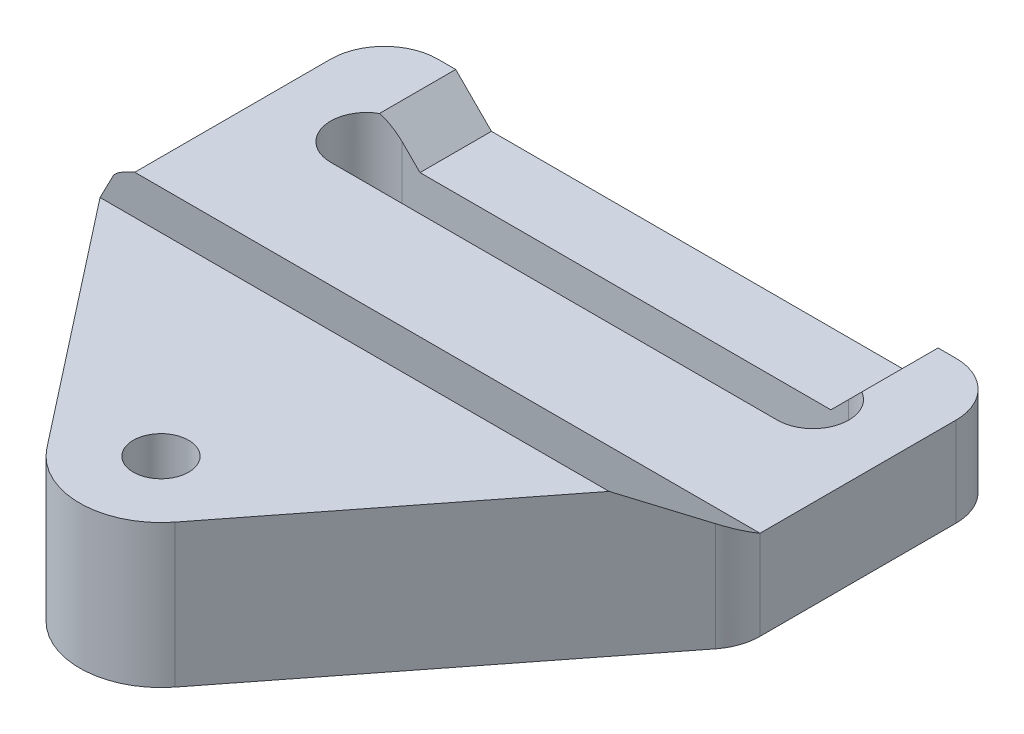
ISO-10303-21;
HEADER;
FILE_DESCRIPTION(('STEP AP214'),'2;1');
FILE_NAME('part.step','',(''),(''),'','','');
FILE_SCHEMA(('AUTOMOTIVE_DESIGN { 1 0 10303 214 1 1 1 1 }'));
ENDSEC;
DATA;
#1=APPLICATION_CONTEXT('core data for automotive mechanical design processes');
#2=APPLICATION_PROTOCOL_DEFINITION('international standard','automotive_design',2000,#1);
#3=PRODUCT_CONTEXT('',#1,'mechanical');
#4=PRODUCT('Part','Part','',(#3));
#5=PRODUCT_RELATED_PRODUCT_CATEGORY('part','',(#4));
#6=PRODUCT_DEFINITION_FORMATION('','',#4);
#7=PRODUCT_DEFINITION_CONTEXT('part definition',#1,'design');
#8=PRODUCT_DEFINITION('design','',#6,#7);
#9=PRODUCT_DEFINITION_SHAPE('','',#8);
#10=(LENGTH_UNIT() NAMED_UNIT(*) SI_UNIT(.MILLI.,.METRE.));
#11=(NAMED_UNIT(*) PLANE_ANGLE_UNIT() SI_UNIT($,.RADIAN.));
#12=(NAMED_UNIT(*) SI_UNIT($,.STERADIAN.) SOLID_ANGLE_UNIT());
#13=UNCERTAINTY_MEASURE_WITH_UNIT(LENGTH_MEASURE(1.E-05),#10,'distance_accuracy_value','');
#14=(GEOMETRIC_REPRESENTATION_CONTEXT(3) GLOBAL_UNCERTAINTY_ASSIGNED_CONTEXT((#13)) GLOBAL_UNIT_ASSIGNED_CONTEXT((#10,
#11,#12)) REPRESENTATION_CONTEXT('',''));
#15=CARTESIAN_POINT('',(0.,0.,0.));
#16=DIRECTION('',(0.,0.,1.));
#17=DIRECTION('',(1.,0.,0.));
#18=AXIS2_PLACEMENT_3D('',#15,#16,#17);
#19=CARTESIAN_POINT('',(12.5,5.,-24.));
#20=DIRECTION('',(0.,-1.,0.));
#21=DIRECTION('',(0.,0.,-1.));
#22=AXIS2_PLACEMENT_3D('',#19,#20,#21);
#23=CYLINDRICAL_SURFACE('',#22,1.99999999999999);
#24=CARTESIAN_POINT('',(12.5,5.,-24.));
#25=DIRECTION('',(0.,1.,0.));
#26=DIRECTION('',(0.,0.,1.));
#27=AXIS2_PLACEMENT_3D('',#24,#25,#26);
#28=CIRCLE('',#27,1.99999999999999);
#29=CARTESIAN_POINT('',(12.5,5.,-22.));
#30=VERTEX_POINT('',#29);
#31=CARTESIAN_POINT('',(13.5,5.,-25.7320508075689));
#32=VERTEX_POINT('',#31);
#33=EDGE_CURVE('E222',#30,#32,#28,.T.);
#34=ORIENTED_EDGE('',*,*,#33,.T.);
#35=CARTESIAN_POINT('',(12.5,4.00000000000006,-24.));
#36=DIRECTION('',(-0.707106781186544,0.707106781186551,0.));
#37=DIRECTION('',(-0.707106781186551,-0.707106781186544,0.));
#38=AXIS2_PLACEMENT_3D('',#35,#36,#37);
#39=ELLIPSE('',#38,2.82842712474616,1.99999999999999);
#40=CARTESIAN_POINT('',(12.5,4.00000000000006,-26.));
#41=VERTEX_POINT('',#40);
#42=EDGE_CURVE('E333',#32,#41,#39,.T.);
#43=ORIENTED_EDGE('',*,*,#42,.T.);
#44=DIRECTION('',(0.,-1.,0.));
#45=VECTOR('',#44,1.);
#46=CARTESIAN_POINT('',(12.5,5.,-26.));
#47=LINE('',#46,#45);
#48=CARTESIAN_POINT('',(12.5,0.,-26.));
#49=VERTEX_POINT('',#48);
#50=EDGE_CURVE('E256',#41,#49,#47,.T.);
#51=ORIENTED_EDGE('',*,*,#50,.T.);
#52=CARTESIAN_POINT('',(12.5,0.,-24.));
#53=DIRECTION('',(0.,1.,0.));
#54=DIRECTION('',(0.,0.,1.));
#55=AXIS2_PLACEMENT_3D('',#52,#53,#54);
#56=CIRCLE('',#55,1.99999999999999);
#57=CARTESIAN_POINT('',(12.5,0.,-22.));
#58=VERTEX_POINT('',#57);
#59=EDGE_CURVE('E221',#58,#49,#56,.T.);
#60=ORIENTED_EDGE('',*,*,#59,.F.);
#61=DIRECTION('',(0.,-1.,0.));
#62=VECTOR('',#61,1.);
#63=CARTESIAN_POINT('',(12.5,5.,-22.));
#64=LINE('',#63,#62);
#65=EDGE_CURVE('E232',#30,#58,#64,.T.);
#66=ORIENTED_EDGE('',*,*,#65,.F.);
#67=EDGE_LOOP('',(#34,#43,#51,#60,#66));
#68=FACE_BOUND('',#67,.T.);
#69=ADVANCED_FACE('F41',(#68),#23,.F.);
#70=CARTESIAN_POINT('',(0.,5.,0.));
#71=DIRECTION('',(0.,1.,0.));
#72=DIRECTION('',(0.,0.,1.));
#73=AXIS2_PLACEMENT_3D('',#70,#71,#72);
#74=PLANE('',#73);
#75=DIRECTION('',(-1.,0.,0.));
#76=VECTOR('',#75,1.);
#77=CARTESIAN_POINT('',(-17.5,5.,-16.0333739025132));
#78=LINE('',#77,#76);
#79=CARTESIAN_POINT('',(17.5,5.,-16.0333739025132));
#80=VERTEX_POINT('',#79);
#81=CARTESIAN_POINT('',(-17.5,5.,-16.0333739025132));
#82=VERTEX_POINT('',#81);
#83=EDGE_CURVE('E203',#80,#82,#78,.T.);
#84=ORIENTED_EDGE('',*,*,#83,.F.);
#85=DIRECTION('',(0.,0.,-1.));
#86=VECTOR('',#85,1.);
#87=CARTESIAN_POINT('',(17.5,5.,-27.));
#88=LINE('',#87,#86);
#89=CARTESIAN_POINT('',(17.5,5.,-27.));
#90=VERTEX_POINT('',#89);
#91=EDGE_CURVE('E263',#80,#90,#88,.T.);
#92=ORIENTED_EDGE('',*,*,#91,.T.);
#93=CARTESIAN_POINT('',(14.5,5.,-27.));
#94=DIRECTION('',(0.,1.,0.));
#95=DIRECTION('',(0.,0.,-1.));
#96=AXIS2_PLACEMENT_3D('',#93,#94,#95);
#97=CIRCLE('',#96,3.);
#98=CARTESIAN_POINT('',(14.5,5.,-30.));
#99=VERTEX_POINT('',#98);
#100=EDGE_CURVE('E266',#90,#99,#97,.T.);
#101=ORIENTED_EDGE('',*,*,#100,.T.);
#102=DIRECTION('',(-1.,0.,0.));
#103=VECTOR('',#102,1.);
#104=CARTESIAN_POINT('',(-14.5,5.,-30.));
#105=LINE('',#104,#103);
#106=CARTESIAN_POINT('',(13.5,5.,-30.));
#107=VERTEX_POINT('',#106);
#108=EDGE_CURVE('E354',#99,#107,#105,.T.);
#109=ORIENTED_EDGE('',*,*,#108,.T.);
#110=DIRECTION('',(0.,0.,-1.));
#111=VECTOR('',#110,1.);
#112=CARTESIAN_POINT('',(13.4999999999999,5.,0.));
#113=LINE('',#112,#111);
#114=EDGE_CURVE('E329',#107,#32,#113,.F.);
#115=ORIENTED_EDGE('',*,*,#114,.T.);
#116=ORIENTED_EDGE('',*,*,#33,.F.);
#117=DIRECTION('',(1.,0.,0.));
#118=VECTOR('',#117,1.);
#119=CARTESIAN_POINT('',(12.5,5.,-22.));
#120=LINE('',#119,#118);
#121=CARTESIAN_POINT('',(-12.5,5.,-22.));
#122=VERTEX_POINT('',#121);
#123=EDGE_CURVE('E229',#122,#30,#120,.T.);
#124=ORIENTED_EDGE('',*,*,#123,.F.);
#125=CARTESIAN_POINT('',(-12.5,5.,-24.));
#126=DIRECTION('',(0.,1.,0.));
#127=DIRECTION('',(0.,0.,1.));
#128=AXIS2_PLACEMENT_3D('',#125,#126,#127);
#129=CIRCLE('',#128,1.99999999999999);
#130=CARTESIAN_POINT('',(-13.5,5.,-25.7320508075689));
#131=VERTEX_POINT('',#130);
#132=EDGE_CURVE('E225',#131,#122,#129,.T.);
#133=ORIENTED_EDGE('',*,*,#132,.F.);
#134=DIRECTION('',(0.,0.,1.));
#135=VECTOR('',#134,1.);
#136=CARTESIAN_POINT('',(-13.4999999999999,5.,0.));
#137=LINE('',#136,#135);
#138=CARTESIAN_POINT('',(-13.5,5.,-30.));
#139=VERTEX_POINT('',#138);
#140=EDGE_CURVE('E348',#131,#139,#137,.F.);
#141=ORIENTED_EDGE('',*,*,#140,.T.);
#142=DIRECTION('',(1.,0.,0.));
#143=VECTOR('',#142,1.);
#144=CARTESIAN_POINT('',(0.,5.,-30.));
#145=LINE('',#144,#143);
#146=CARTESIAN_POINT('',(-14.5,5.,-30.));
#147=VERTEX_POINT('',#146);
#148=EDGE_CURVE('E358',#147,#139,#145,.T.);
#149=ORIENTED_EDGE('',*,*,#148,.F.);
#150=CARTESIAN_POINT('',(-14.5,5.,-27.));
#151=DIRECTION('',(0.,1.,0.));
#152=DIRECTION('',(0.,0.,-1.));
#153=AXIS2_PLACEMENT_3D('',#150,#151,#152);
#154=CIRCLE('',#153,3.);
#155=CARTESIAN_POINT('',(-17.5,5.,-27.));
#156=VERTEX_POINT('',#155);
#157=EDGE_CURVE('E271',#147,#156,#154,.T.);
#158=ORIENTED_EDGE('',*,*,#157,.T.);
#159=DIRECTION('',(0.,0.,1.));
#160=VECTOR('',#159,1.);
#161=CARTESIAN_POINT('',(-17.5,5.,-15.));
#162=LINE('',#161,#160);
#163=EDGE_CURVE('E274',#156,#82,#162,.T.);
#164=ORIENTED_EDGE('',*,*,#163,.T.);
#165=EDGE_LOOP('',(#84,#92,#101,#109,#115,#116,#124,#133,#141,#149,#158,#164));
#166=FACE_BOUND('',#165,.T.);
#167=ADVANCED_FACE('F398',(#166),#74,.T.);
#168=CARTESIAN_POINT('',(0.,0.,0.));
#169=DIRECTION('',(0.,1.,0.));
#170=DIRECTION('',(0.,0.,1.));
#171=AXIS2_PLACEMENT_3D('',#168,#169,#170);
#172=PLANE('',#171);
#173=CARTESIAN_POINT('',(0.,0.,0.));
#174=DIRECTION('',(0.,1.,0.));
#175=DIRECTION('',(0.,0.,1.));
#176=AXIS2_PLACEMENT_3D('',#173,#174,#175);
#177=CIRCLE('',#176,1.55);
#178=CARTESIAN_POINT('',(0.,0.,1.55));
#179=VERTEX_POINT('',#178);
#180=EDGE_CURVE('E259',#179,#179,#177,.T.);
#181=ORIENTED_EDGE('',*,*,#180,.T.);
#182=EDGE_LOOP('',(#181));
#183=FACE_BOUND('',#182,.T.);
#184=DIRECTION('',(0.,0.,-1.));
#185=VECTOR('',#184,1.);
#186=CARTESIAN_POINT('',(17.5,0.,-27.));
#187=LINE('',#186,#185);
#188=CARTESIAN_POINT('',(17.5,0.,-16.0333739025132));
#189=VERTEX_POINT('',#188);
#190=CARTESIAN_POINT('',(17.5,0.,-27.));
#191=VERTEX_POINT('',#190);
#192=EDGE_CURVE('E284',#189,#191,#187,.T.);
#193=ORIENTED_EDGE('',*,*,#192,.F.);
#194=CARTESIAN_POINT('',(14.5,0.,-16.0333739025132));
#195=DIRECTION('',(0.,1.,0.));
#196=DIRECTION('',(0.,0.,1.));
#197=AXIS2_PLACEMENT_3D('',#194,#195,#196);
#198=CIRCLE('',#197,3.);
#199=CARTESIAN_POINT('',(16.8636017284823,0.,-14.1858385526171));
#200=VERTEX_POINT('',#199);
#201=EDGE_CURVE('E369',#189,#200,#198,.F.);
#202=ORIENTED_EDGE('',*,*,#201,.T.);
#203=DIRECTION('',(0.615845116632009,0.,-0.787867242827436));
#204=VECTOR('',#203,1.);
#205=CARTESIAN_POINT('',(17.5,0.,-15.));
#206=LINE('',#205,#204);
#207=CARTESIAN_POINT('',(3.58479595486484,0.,2.80209528067564));
#208=VERTEX_POINT('',#207);
#209=EDGE_CURVE('E281',#208,#200,#206,.T.);
#210=ORIENTED_EDGE('',*,*,#209,.F.);
#211=CARTESIAN_POINT('',(0.,0.,0.));
#212=DIRECTION('',(0.,1.,0.));
#213=DIRECTION('',(0.,0.,1.));
#214=AXIS2_PLACEMENT_3D('',#211,#212,#213);
#215=CIRCLE('',#214,4.55);
#216=CARTESIAN_POINT('',(-3.58479595486484,0.,2.80209528067564));
#217=VERTEX_POINT('',#216);
#218=EDGE_CURVE('E182',#217,#208,#215,.T.);
#219=ORIENTED_EDGE('',*,*,#218,.F.);
#220=DIRECTION('',(0.615845116632009,0.,0.787867242827436));
#221=VECTOR('',#220,1.);
#222=CARTESIAN_POINT('',(-3.58479595486484,0.,2.80209528067564));
#223=LINE('',#222,#221);
#224=CARTESIAN_POINT('',(-16.8636017284823,0.,-14.1858385526171));
#225=VERTEX_POINT('',#224);
#226=EDGE_CURVE('E267',#225,#217,#223,.T.);
#227=ORIENTED_EDGE('',*,*,#226,.F.);
#228=CARTESIAN_POINT('',(-14.5,0.,-16.0333739025132));
#229=DIRECTION('',(0.,1.,0.));
#230=DIRECTION('',(0.,0.,1.));
#231=AXIS2_PLACEMENT_3D('',#228,#229,#230);
#232=CIRCLE('',#231,3.);
#233=CARTESIAN_POINT('',(-17.5,0.,-16.0333739025132));
#234=VERTEX_POINT('',#233);
#235=EDGE_CURVE('E366',#225,#234,#232,.F.);
#236=ORIENTED_EDGE('',*,*,#235,.T.);
#237=DIRECTION('',(0.,0.,1.));
#238=VECTOR('',#237,1.);
#239=CARTESIAN_POINT('',(-17.5,0.,-15.));
#240=LINE('',#239,#238);
#241=CARTESIAN_POINT('',(-17.5,0.,-27.));
#242=VERTEX_POINT('',#241);
#243=EDGE_CURVE('E298',#242,#234,#240,.T.);
#244=ORIENTED_EDGE('',*,*,#243,.F.);
#245=CARTESIAN_POINT('',(-14.5,0.,-27.));
#246=DIRECTION('',(0.,1.,0.));
#247=DIRECTION('',(0.,0.,-1.));
#248=AXIS2_PLACEMENT_3D('',#245,#246,#247);
#249=CIRCLE('',#248,3.);
#250=CARTESIAN_POINT('',(-14.5,0.,-30.));
#251=VERTEX_POINT('',#250);
#252=EDGE_CURVE('E295',#251,#242,#249,.T.);
#253=ORIENTED_EDGE('',*,*,#252,.F.);
#254=DIRECTION('',(-1.,0.,0.));
#255=VECTOR('',#254,1.);
#256=CARTESIAN_POINT('',(-14.5,0.,-30.));
#257=LINE('',#256,#255);
#258=CARTESIAN_POINT('',(14.5,0.,-30.));
#259=VERTEX_POINT('',#258);
#260=EDGE_CURVE('E291',#259,#251,#257,.T.);
#261=ORIENTED_EDGE('',*,*,#260,.F.);
#262=CARTESIAN_POINT('',(14.5,0.,-27.));
#263=DIRECTION('',(0.,1.,0.));
#264=DIRECTION('',(0.,0.,-1.));
#265=AXIS2_PLACEMENT_3D('',#262,#263,#264);
#266=CIRCLE('',#265,3.);
#267=EDGE_CURVE('E287',#191,#259,#266,.T.);
#268=ORIENTED_EDGE('',*,*,#267,.F.);
#269=EDGE_LOOP('',(#193,#202,#210,#219,#227,#236,#244,#253,#261,#268));
#270=FACE_BOUND('',#269,.T.);
#271=ORIENTED_EDGE('',*,*,#59,.T.);
#272=DIRECTION('',(-1.,0.,0.));
#273=VECTOR('',#272,1.);
#274=CARTESIAN_POINT('',(12.5,0.,-26.));
#275=LINE('',#274,#273);
#276=CARTESIAN_POINT('',(-12.5,0.,-26.));
#277=VERTEX_POINT('',#276);
#278=EDGE_CURVE('E236',#49,#277,#275,.T.);
#279=ORIENTED_EDGE('',*,*,#278,.T.);
#280=CARTESIAN_POINT('',(-12.5,0.,-24.));
#281=DIRECTION('',(0.,1.,0.));
#282=DIRECTION('',(0.,0.,1.));
#283=AXIS2_PLACEMENT_3D('',#280,#281,#282);
#284=CIRCLE('',#283,1.99999999999999);
#285=CARTESIAN_POINT('',(-12.5,0.,-22.));
#286=VERTEX_POINT('',#285);
#287=EDGE_CURVE('E240',#277,#286,#284,.T.);
#288=ORIENTED_EDGE('',*,*,#287,.T.);
#289=DIRECTION('',(1.,0.,0.));
#290=VECTOR('',#289,1.);
#291=CARTESIAN_POINT('',(12.5,0.,-22.));
#292=LINE('',#291,#290);
#293=EDGE_CURVE('E226',#286,#58,#292,.T.);
#294=ORIENTED_EDGE('',*,*,#293,.T.);
#295=EDGE_LOOP('',(#271,#279,#288,#294));
#296=FACE_BOUND('',#295,.T.);
#297=ADVANCED_FACE('F410',(#183,#270,#296),#172,.F.);
#298=CARTESIAN_POINT('',(0.,5.,0.));
#299=DIRECTION('',(0.,-1.,0.));
#300=DIRECTION('',(0.,0.,-1.));
#301=AXIS2_PLACEMENT_3D('',#298,#299,#300);
#302=CYLINDRICAL_SURFACE('',#301,4.55);
#303=ORIENTED_EDGE('',*,*,#218,.T.);
#304=DIRECTION('',(0.,-1.,0.));
#305=VECTOR('',#304,1.);
#306=CARTESIAN_POINT('',(3.58479595486484,5.,2.80209528067564));
#307=LINE('',#306,#305);
#308=CARTESIAN_POINT('',(3.58479595486484,8.,2.80209528067564));
#309=VERTEX_POINT('',#308);
#310=EDGE_CURVE('E175',#309,#208,#307,.T.);
#311=ORIENTED_EDGE('',*,*,#310,.F.);
#312=CARTESIAN_POINT('',(0.,8.,0.));
#313=DIRECTION('',(0.,1.,0.));
#314=DIRECTION('',(0.,0.,1.));
#315=AXIS2_PLACEMENT_3D('',#312,#313,#314);
#316=CIRCLE('',#315,4.55);
#317=CARTESIAN_POINT('',(-3.58479595486484,8.,2.80209528067564));
#318=VERTEX_POINT('',#317);
#319=EDGE_CURVE('E180',#318,#309,#316,.T.);
#320=ORIENTED_EDGE('',*,*,#319,.F.);
#321=DIRECTION('',(0.,-1.,0.));
#322=VECTOR('',#321,1.);
#323=CARTESIAN_POINT('',(-3.58479595486484,5.,2.80209528067564));
#324=LINE('',#323,#322);
#325=EDGE_CURVE('E278',#318,#217,#324,.T.);
#326=ORIENTED_EDGE('',*,*,#325,.T.);
#327=EDGE_LOOP('',(#303,#311,#320,#326));
#328=FACE_BOUND('',#327,.T.);
#329=ADVANCED_FACE('F177',(#328),#302,.T.);
#330=CARTESIAN_POINT('',(17.5,5.,-15.));
#331=DIRECTION('',(-0.787867242827437,0.,-0.615845116632009));
#332=DIRECTION('',(-0.615845116632009,0.,0.787867242827437));
#333=AXIS2_PLACEMENT_3D('',#330,#331,#332);
#334=PLANE('',#333);
#335=DIRECTION('',(0.,-1.,0.));
#336=VECTOR('',#335,1.);
#337=CARTESIAN_POINT('',(16.8636017284823,5.,-14.1858385526171));
#338=LINE('',#337,#336);
#339=CARTESIAN_POINT('',(16.8636017284823,6.06667503159982,-14.1858385526171));
#340=VERTEX_POINT('',#339);
#341=EDGE_CURVE('E372',#200,#340,#338,.F.);
#342=ORIENTED_EDGE('',*,*,#341,.T.);
#343=DIRECTION('',(-0.56057505957921,0.414051809130744,0.717158770380258));
#344=VECTOR('',#343,1.);
#345=CARTESIAN_POINT('',(9.76935542196278,11.3066254493698,-5.1099781998978));
#346=LINE('',#345,#344);
#347=CARTESIAN_POINT('',(14.2461182748484,8.,-10.8372214798065));
#348=VERTEX_POINT('',#347);
#349=EDGE_CURVE('E11',#340,#348,#346,.T.);
#350=ORIENTED_EDGE('',*,*,#349,.T.);
#351=DIRECTION('',(0.615845116632009,0.,-0.787867242827436));
#352=VECTOR('',#351,1.);
#353=CARTESIAN_POINT('',(3.58479595486484,8.,2.80209528067564));
#354=LINE('',#353,#352);
#355=EDGE_CURVE('E190',#309,#348,#354,.T.);
#356=ORIENTED_EDGE('',*,*,#355,.F.);
#357=ORIENTED_EDGE('',*,*,#310,.T.);
#358=ORIENTED_EDGE('',*,*,#209,.T.);
#359=EDGE_LOOP('',(#342,#350,#356,#357,#358));
#360=FACE_BOUND('',#359,.T.);
#361=ADVANCED_FACE('F191',(#360),#334,.F.);
#362=CARTESIAN_POINT('',(17.5,5.,-27.));
#363=DIRECTION('',(-1.,0.,0.));
#364=DIRECTION('',(0.,0.,1.));
#365=AXIS2_PLACEMENT_3D('',#362,#363,#364);
#366=PLANE('',#365);
#367=ORIENTED_EDGE('',*,*,#91,.F.);
#368=DIRECTION('',(0.,-1.,0.));
#369=VECTOR('',#368,1.);
#370=CARTESIAN_POINT('',(17.5,5.,-16.0333739025132));
#371=LINE('',#370,#369);
#372=EDGE_CURVE('E362',#80,#189,#371,.T.);
#373=ORIENTED_EDGE('',*,*,#372,.T.);
#374=ORIENTED_EDGE('',*,*,#192,.T.);
#375=DIRECTION('',(0.,-1.,0.));
#376=VECTOR('',#375,1.);
#377=CARTESIAN_POINT('',(17.5,5.,-27.));
#378=LINE('',#377,#376);
#379=EDGE_CURVE('E187',#90,#191,#378,.T.);
#380=ORIENTED_EDGE('',*,*,#379,.F.);
#381=EDGE_LOOP('',(#367,#373,#374,#380));
#382=FACE_BOUND('',#381,.T.);
#383=ADVANCED_FACE('F414',(#382),#366,.F.);
#384=CARTESIAN_POINT('',(14.5,5.,-27.));
#385=DIRECTION('',(0.,-1.,0.));
#386=DIRECTION('',(0.,0.,-1.));
#387=AXIS2_PLACEMENT_3D('',#384,#385,#386);
#388=CYLINDRICAL_SURFACE('',#387,3.);
#389=ORIENTED_EDGE('',*,*,#267,.T.);
#390=DIRECTION('',(0.,-1.,0.));
#391=VECTOR('',#390,1.);
#392=CARTESIAN_POINT('',(14.5,5.,-30.));
#393=LINE('',#392,#391);
#394=EDGE_CURVE('E313',#99,#259,#393,.T.);
#395=ORIENTED_EDGE('',*,*,#394,.F.);
#396=ORIENTED_EDGE('',*,*,#100,.F.);
#397=ORIENTED_EDGE('',*,*,#379,.T.);
#398=EDGE_LOOP('',(#389,#395,#396,#397));
#399=FACE_BOUND('',#398,.T.);
#400=ADVANCED_FACE('F420',(#399),#388,.T.);
#401=CARTESIAN_POINT('',(-14.5,5.,-30.));
#402=DIRECTION('',(0.,0.,1.));
#403=DIRECTION('',(1.,0.,0.));
#404=AXIS2_PLACEMENT_3D('',#401,#402,#403);
#405=PLANE('',#404);
#406=DIRECTION('',(0.,-1.,0.));
#407=VECTOR('',#406,1.);
#408=CARTESIAN_POINT('',(-14.5,5.,-30.));
#409=LINE('',#408,#407);
#410=EDGE_CURVE('E310',#147,#251,#409,.T.);
#411=ORIENTED_EDGE('',*,*,#410,.F.);
#412=ORIENTED_EDGE('',*,*,#148,.T.);
#413=DIRECTION('',(-0.707106781186551,0.707106781186544,0.));
#414=VECTOR('',#413,1.);
#415=CARTESIAN_POINT('',(-14.,5.5,-30.));
#416=LINE('',#415,#414);
#417=CARTESIAN_POINT('',(-11.5,3.,-30.));
#418=VERTEX_POINT('',#417);
#419=EDGE_CURVE('E351',#139,#418,#416,.F.);
#420=ORIENTED_EDGE('',*,*,#419,.T.);
#421=DIRECTION('',(-1.,0.,0.));
#422=VECTOR('',#421,1.);
#423=CARTESIAN_POINT('',(-14.5,3.,-30.));
#424=LINE('',#423,#422);
#425=CARTESIAN_POINT('',(11.4999999999999,3.,-30.));
#426=VERTEX_POINT('',#425);
#427=EDGE_CURVE('E212',#426,#418,#424,.T.);
#428=ORIENTED_EDGE('',*,*,#427,.F.);
#429=DIRECTION('',(-0.707106781186551,-0.707106781186544,0.));
#430=VECTOR('',#429,1.);
#431=CARTESIAN_POINT('',(-0.500000000000157,-8.99999999999997,-30.));
#432=LINE('',#431,#430);
#433=EDGE_CURVE('E326',#426,#107,#432,.F.);
#434=ORIENTED_EDGE('',*,*,#433,.T.);
#435=ORIENTED_EDGE('',*,*,#108,.F.);
#436=ORIENTED_EDGE('',*,*,#394,.T.);
#437=ORIENTED_EDGE('',*,*,#260,.T.);
#438=EDGE_LOOP('',(#411,#412,#420,#428,#434,#435,#436,#437));
#439=FACE_BOUND('',#438,.T.);
#440=ADVANCED_FACE('F448',(#439),#405,.F.);
#441=CARTESIAN_POINT('',(-14.5,5.,-27.));
#442=DIRECTION('',(0.,-1.,0.));
#443=DIRECTION('',(0.,0.,-1.));
#444=AXIS2_PLACEMENT_3D('',#441,#442,#443);
#445=CYLINDRICAL_SURFACE('',#444,3.);
#446=ORIENTED_EDGE('',*,*,#252,.T.);
#447=DIRECTION('',(0.,-1.,0.));
#448=VECTOR('',#447,1.);
#449=CARTESIAN_POINT('',(-17.5,5.,-27.));
#450=LINE('',#449,#448);
#451=EDGE_CURVE('E306',#156,#242,#450,.T.);
#452=ORIENTED_EDGE('',*,*,#451,.F.);
#453=ORIENTED_EDGE('',*,*,#157,.F.);
#454=ORIENTED_EDGE('',*,*,#410,.T.);
#455=EDGE_LOOP('',(#446,#452,#453,#454));
#456=FACE_BOUND('',#455,.T.);
#457=ADVANCED_FACE('F451',(#456),#445,.T.);
#458=CARTESIAN_POINT('',(-17.5,5.,-15.));
#459=DIRECTION('',(1.,0.,0.));
#460=DIRECTION('',(0.,0.,-1.));
#461=AXIS2_PLACEMENT_3D('',#458,#459,#460);
#462=PLANE('',#461);
#463=ORIENTED_EDGE('',*,*,#243,.T.);
#464=DIRECTION('',(0.,-1.,0.));
#465=VECTOR('',#464,1.);
#466=CARTESIAN_POINT('',(-17.5,5.,-16.0333739025132));
#467=LINE('',#466,#465);
#468=EDGE_CURVE('E378',#234,#82,#467,.F.);
#469=ORIENTED_EDGE('',*,*,#468,.T.);
#470=ORIENTED_EDGE('',*,*,#163,.F.);
#471=ORIENTED_EDGE('',*,*,#451,.T.);
#472=EDGE_LOOP('',(#463,#469,#470,#471));
#473=FACE_BOUND('',#472,.T.);
#474=ADVANCED_FACE('F404',(#473),#462,.F.);
#475=CARTESIAN_POINT('',(-3.58479595486484,5.,2.80209528067564));
#476=DIRECTION('',(0.787867242827437,0.,-0.615845116632009));
#477=DIRECTION('',(-0.615845116632009,0.,-0.787867242827437));
#478=AXIS2_PLACEMENT_3D('',#475,#476,#477);
#479=PLANE('',#478);
#480=DIRECTION('',(0.615845116632009,0.,0.787867242827437));
#481=VECTOR('',#480,1.);
#482=CARTESIAN_POINT('',(-16.8636017284823,8.,-14.1858385526171));
#483=LINE('',#482,#481);
#484=CARTESIAN_POINT('',(-14.2461182748484,8.,-10.8372214798065));
#485=VERTEX_POINT('',#484);
#486=EDGE_CURVE('E197',#485,#318,#483,.T.);
#487=ORIENTED_EDGE('',*,*,#486,.F.);
#488=DIRECTION('',(-0.56057505957921,-0.414051809130744,-0.717158770380258));
#489=VECTOR('',#488,1.);
#490=CARTESIAN_POINT('',(-9.76935542196279,11.3066254493698,-5.1099781998978));
#491=LINE('',#490,#489);
#492=CARTESIAN_POINT('',(-16.8636017284823,6.06667503159982,-14.1858385526171));
#493=VERTEX_POINT('',#492);
#494=EDGE_CURVE('E65',#485,#493,#491,.T.);
#495=ORIENTED_EDGE('',*,*,#494,.T.);
#496=DIRECTION('',(0.,-1.,0.));
#497=VECTOR('',#496,1.);
#498=CARTESIAN_POINT('',(-16.8636017284823,5.,-14.1858385526171));
#499=LINE('',#498,#497);
#500=EDGE_CURVE('E375',#493,#225,#499,.T.);
#501=ORIENTED_EDGE('',*,*,#500,.T.);
#502=ORIENTED_EDGE('',*,*,#226,.T.);
#503=ORIENTED_EDGE('',*,*,#325,.F.);
#504=EDGE_LOOP('',(#487,#495,#501,#502,#503));
#505=FACE_BOUND('',#504,.T.);
#506=ADVANCED_FACE('F406',(#505),#479,.F.);
#507=CARTESIAN_POINT('',(0.,5.,0.));
#508=DIRECTION('',(0.,-1.,0.));
#509=DIRECTION('',(0.,0.,-1.));
#510=AXIS2_PLACEMENT_3D('',#507,#508,#509);
#511=CYLINDRICAL_SURFACE('',#510,1.55);
#512=ORIENTED_EDGE('',*,*,#180,.F.);
#513=EDGE_LOOP('',(#512));
#514=FACE_BOUND('',#513,.T.);
#515=CARTESIAN_POINT('',(0.,8.,0.));
#516=DIRECTION('',(0.,1.,0.));
#517=DIRECTION('',(0.,0.,1.));
#518=AXIS2_PLACEMENT_3D('',#515,#516,#517);
#519=CIRCLE('',#518,1.55);
#520=CARTESIAN_POINT('',(0.,8.,1.55));
#521=VERTEX_POINT('',#520);
#522=EDGE_CURVE('E207',#521,#521,#519,.T.);
#523=ORIENTED_EDGE('',*,*,#522,.T.);
#524=EDGE_LOOP('',(#523));
#525=FACE_BOUND('',#524,.T.);
#526=ADVANCED_FACE('F470',(#514,#525),#511,.F.);
#527=CARTESIAN_POINT('',(12.5,5.,-26.));
#528=DIRECTION('',(0.,0.,1.));
#529=DIRECTION('',(1.,0.,0.));
#530=AXIS2_PLACEMENT_3D('',#527,#528,#529);
#531=PLANE('',#530);
#532=DIRECTION('',(1.,0.,0.));
#533=VECTOR('',#532,1.);
#534=CARTESIAN_POINT('',(12.5,3.,-26.));
#535=LINE('',#534,#533);
#536=CARTESIAN_POINT('',(-11.4999999999999,3.,-26.));
#537=VERTEX_POINT('',#536);
#538=CARTESIAN_POINT('',(11.4999999999999,3.,-26.));
#539=VERTEX_POINT('',#538);
#540=EDGE_CURVE('E217',#537,#539,#535,.T.);
#541=ORIENTED_EDGE('',*,*,#540,.F.);
#542=DIRECTION('',(0.707106781186551,-0.707106781186544,0.));
#543=VECTOR('',#542,1.);
#544=CARTESIAN_POINT('',(-11.4999999999999,2.99999999999995,-26.));
#545=LINE('',#544,#543);
#546=CARTESIAN_POINT('',(-12.5,4.00000000000005,-26.));
#547=VERTEX_POINT('',#546);
#548=EDGE_CURVE('E340',#537,#547,#545,.F.);
#549=ORIENTED_EDGE('',*,*,#548,.T.);
#550=DIRECTION('',(0.,-1.,0.));
#551=VECTOR('',#550,1.);
#552=CARTESIAN_POINT('',(-12.5,5.,-26.));
#553=LINE('',#552,#551);
#554=EDGE_CURVE('E253',#547,#277,#553,.T.);
#555=ORIENTED_EDGE('',*,*,#554,.T.);
#556=ORIENTED_EDGE('',*,*,#278,.F.);
#557=ORIENTED_EDGE('',*,*,#50,.F.);
#558=DIRECTION('',(0.707106781186551,0.707106781186544,0.));
#559=VECTOR('',#558,1.);
#560=CARTESIAN_POINT('',(11.4999999999999,2.99999999999999,-26.));
#561=LINE('',#560,#559);
#562=EDGE_CURVE('E337',#41,#539,#561,.F.);
#563=ORIENTED_EDGE('',*,*,#562,.T.);
#564=EDGE_LOOP('',(#541,#549,#555,#556,#557,#563));
#565=FACE_BOUND('',#564,.T.);
#566=ADVANCED_FACE('F468',(#565),#531,.T.);
#567=CARTESIAN_POINT('',(-12.5,5.,-24.));
#568=DIRECTION('',(0.,-1.,0.));
#569=DIRECTION('',(0.,0.,-1.));
#570=AXIS2_PLACEMENT_3D('',#567,#568,#569);
#571=CYLINDRICAL_SURFACE('',#570,1.99999999999999);
#572=ORIENTED_EDGE('',*,*,#554,.F.);
#573=CARTESIAN_POINT('',(-12.5,4.00000000000006,-24.));
#574=DIRECTION('',(0.707106781186544,0.707106781186551,0.));
#575=DIRECTION('',(0.707106781186551,-0.707106781186544,0.));
#576=AXIS2_PLACEMENT_3D('',#573,#574,#575);
#577=ELLIPSE('',#576,2.82842712474616,1.99999999999999);
#578=EDGE_CURVE('E344',#547,#131,#577,.T.);
#579=ORIENTED_EDGE('',*,*,#578,.T.);
#580=ORIENTED_EDGE('',*,*,#132,.T.);
#581=DIRECTION('',(0.,-1.,0.));
#582=VECTOR('',#581,1.);
#583=CARTESIAN_POINT('',(-12.5,5.,-22.));
#584=LINE('',#583,#582);
#585=EDGE_CURVE('E250',#122,#286,#584,.T.);
#586=ORIENTED_EDGE('',*,*,#585,.T.);
#587=ORIENTED_EDGE('',*,*,#287,.F.);
#588=EDGE_LOOP('',(#572,#579,#580,#586,#587));
#589=FACE_BOUND('',#588,.T.);
#590=ADVANCED_FACE('F441',(#589),#571,.F.);
#591=CARTESIAN_POINT('',(12.5,5.,-22.));
#592=DIRECTION('',(0.,0.,-1.));
#593=DIRECTION('',(-1.,0.,0.));
#594=AXIS2_PLACEMENT_3D('',#591,#592,#593);
#595=PLANE('',#594);
#596=ORIENTED_EDGE('',*,*,#293,.F.);
#597=ORIENTED_EDGE('',*,*,#585,.F.);
#598=ORIENTED_EDGE('',*,*,#123,.T.);
#599=ORIENTED_EDGE('',*,*,#65,.T.);
#600=EDGE_LOOP('',(#596,#597,#598,#599));
#601=FACE_BOUND('',#600,.T.);
#602=ADVANCED_FACE('F438',(#601),#595,.T.);
#603=CARTESIAN_POINT('',(0.,3.,0.));
#604=DIRECTION('',(0.,-1.,0.));
#605=DIRECTION('',(0.,0.,-1.));
#606=AXIS2_PLACEMENT_3D('',#603,#604,#605);
#607=PLANE('',#606);
#608=ORIENTED_EDGE('',*,*,#540,.T.);
#609=DIRECTION('',(0.,0.,-1.));
#610=VECTOR('',#609,1.);
#611=CARTESIAN_POINT('',(11.4999999999999,3.,-30.));
#612=LINE('',#611,#610);
#613=EDGE_CURVE('E322',#539,#426,#612,.T.);
#614=ORIENTED_EDGE('',*,*,#613,.T.);
#615=ORIENTED_EDGE('',*,*,#427,.T.);
#616=DIRECTION('',(0.,0.,1.));
#617=VECTOR('',#616,1.);
#618=CARTESIAN_POINT('',(-11.4999999999999,3.,-24.));
#619=LINE('',#618,#617);
#620=EDGE_CURVE('E186',#418,#537,#619,.T.);
#621=ORIENTED_EDGE('',*,*,#620,.T.);
#622=EDGE_LOOP('',(#608,#614,#615,#621));
#623=FACE_BOUND('',#622,.T.);
#624=ADVANCED_FACE('F507',(#623),#607,.F.);
#625=CARTESIAN_POINT('',(11.4999999999999,3.,0.));
#626=DIRECTION('',(-0.707106781186544,0.707106781186551,0.));
#627=DIRECTION('',(0.,0.,1.));
#628=AXIS2_PLACEMENT_3D('',#625,#626,#627);
#629=PLANE('',#628);
#630=ORIENTED_EDGE('',*,*,#42,.F.);
#631=ORIENTED_EDGE('',*,*,#114,.F.);
#632=ORIENTED_EDGE('',*,*,#433,.F.);
#633=ORIENTED_EDGE('',*,*,#613,.F.);
#634=ORIENTED_EDGE('',*,*,#562,.F.);
#635=EDGE_LOOP('',(#630,#631,#632,#633,#634));
#636=FACE_BOUND('',#635,.T.);
#637=ADVANCED_FACE('F428',(#636),#629,.T.);
#638=CARTESIAN_POINT('',(-11.4999999999998,3.,0.));
#639=DIRECTION('',(0.707106781186544,0.707106781186551,0.));
#640=DIRECTION('',(0.,0.,-1.));
#641=AXIS2_PLACEMENT_3D('',#638,#639,#640);
#642=PLANE('',#641);
#643=ORIENTED_EDGE('',*,*,#419,.F.);
#644=ORIENTED_EDGE('',*,*,#140,.F.);
#645=ORIENTED_EDGE('',*,*,#578,.F.);
#646=ORIENTED_EDGE('',*,*,#548,.F.);
#647=ORIENTED_EDGE('',*,*,#620,.F.);
#648=EDGE_LOOP('',(#643,#644,#645,#646,#647));
#649=FACE_BOUND('',#648,.T.);
#650=ADVANCED_FACE('F446',(#649),#642,.T.);
#651=CARTESIAN_POINT('',(14.5,5.,-16.0333739025132));
#652=DIRECTION('',(0.,-1.,0.));
#653=DIRECTION('',(0.,0.,-1.));
#654=AXIS2_PLACEMENT_3D('',#651,#652,#653);
#655=CYLINDRICAL_SURFACE('',#654,3.);
#656=ORIENTED_EDGE('',*,*,#372,.F.);
#657=CARTESIAN_POINT('',(14.5,5.,-16.0333739025132));
#658=DIRECTION('',(0.,0.866025403784438,-0.500000000000001));
#659=DIRECTION('',(0.,-0.500000000000001,-0.866025403784438));
#660=AXIS2_PLACEMENT_3D('',#657,#658,#659);
#661=ELLIPSE('',#660,3.46410161513776,3.);
#662=EDGE_CURVE('E51',#80,#340,#661,.F.);
#663=ORIENTED_EDGE('',*,*,#662,.T.);
#664=ORIENTED_EDGE('',*,*,#341,.F.);
#665=ORIENTED_EDGE('',*,*,#201,.F.);
#666=EDGE_LOOP('',(#656,#663,#664,#665));
#667=FACE_BOUND('',#666,.T.);
#668=ADVANCED_FACE('F412',(#667),#655,.T.);
#669=CARTESIAN_POINT('',(-14.5,5.,-16.0333739025132));
#670=DIRECTION('',(0.,-1.,0.));
#671=DIRECTION('',(0.,0.,-1.));
#672=AXIS2_PLACEMENT_3D('',#669,#670,#671);
#673=CYLINDRICAL_SURFACE('',#672,3.);
#674=ORIENTED_EDGE('',*,*,#500,.F.);
#675=CARTESIAN_POINT('',(-14.5,5.,-16.0333739025132));
#676=DIRECTION('',(0.,0.866025403784438,-0.500000000000001));
#677=DIRECTION('',(0.,-0.500000000000001,-0.866025403784438));
#678=AXIS2_PLACEMENT_3D('',#675,#676,#677);
#679=ELLIPSE('',#678,3.46410161513776,3.);
#680=EDGE_CURVE('E387',#493,#82,#679,.F.);
#681=ORIENTED_EDGE('',*,*,#680,.T.);
#682=ORIENTED_EDGE('',*,*,#468,.F.);
#683=ORIENTED_EDGE('',*,*,#235,.F.);
#684=EDGE_LOOP('',(#674,#681,#682,#683));
#685=FACE_BOUND('',#684,.T.);
#686=ADVANCED_FACE('F393',(#685),#673,.T.);
#687=CARTESIAN_POINT('',(0.,8.,0.));
#688=DIRECTION('',(0.,1.,0.));
#689=DIRECTION('',(0.,0.,1.));
#690=AXIS2_PLACEMENT_3D('',#687,#688,#689);
#691=PLANE('',#690);
#692=ORIENTED_EDGE('',*,*,#355,.T.);
#693=DIRECTION('',(-1.,0.,0.));
#694=VECTOR('',#693,1.);
#695=CARTESIAN_POINT('',(-17.5,8.,-10.8372214798065));
#696=LINE('',#695,#694);
#697=EDGE_CURVE('E382',#348,#485,#696,.T.);
#698=ORIENTED_EDGE('',*,*,#697,.T.);
#699=ORIENTED_EDGE('',*,*,#486,.T.);
#700=ORIENTED_EDGE('',*,*,#319,.T.);
#701=EDGE_LOOP('',(#692,#698,#699,#700));
#702=FACE_BOUND('',#701,.T.);
#703=ORIENTED_EDGE('',*,*,#522,.F.);
#704=EDGE_LOOP('',(#703));
#705=FACE_BOUND('',#704,.T.);
#706=ADVANCED_FACE('F199',(#702,#705),#691,.T.);
#707=CARTESIAN_POINT('',(0.,8.,-10.8372214798065));
#708=DIRECTION('',(0.,0.866025403784438,-0.500000000000001));
#709=DIRECTION('',(1.,0.,0.));
#710=AXIS2_PLACEMENT_3D('',#707,#708,#709);
#711=PLANE('',#710);
#712=ORIENTED_EDGE('',*,*,#662,.F.);
#713=ORIENTED_EDGE('',*,*,#83,.T.);
#714=ORIENTED_EDGE('',*,*,#680,.F.);
#715=ORIENTED_EDGE('',*,*,#494,.F.);
#716=ORIENTED_EDGE('',*,*,#697,.F.);
#717=ORIENTED_EDGE('',*,*,#349,.F.);
#718=EDGE_LOOP('',(#712,#713,#714,#715,#716,#717));
#719=FACE_BOUND('',#718,.T.);
#720=ADVANCED_FACE('F44',(#719),#711,.T.);
#721=CLOSED_SHELL('',(#69,#167,#297,#329,#361,#383,#400,#440,#457,#474,#506,#526,#566,#590,#602,
#624,#637,#650,#668,#686,#706,#720));
#722=MANIFOLD_SOLID_BREP('B2',#721);
#723=ADVANCED_BREP_SHAPE_REPRESENTATION('',(#18,#722),#14);
#724=SHAPE_DEFINITION_REPRESENTATION(#9,#723);
ENDSEC;
END-ISO-10303-21;
